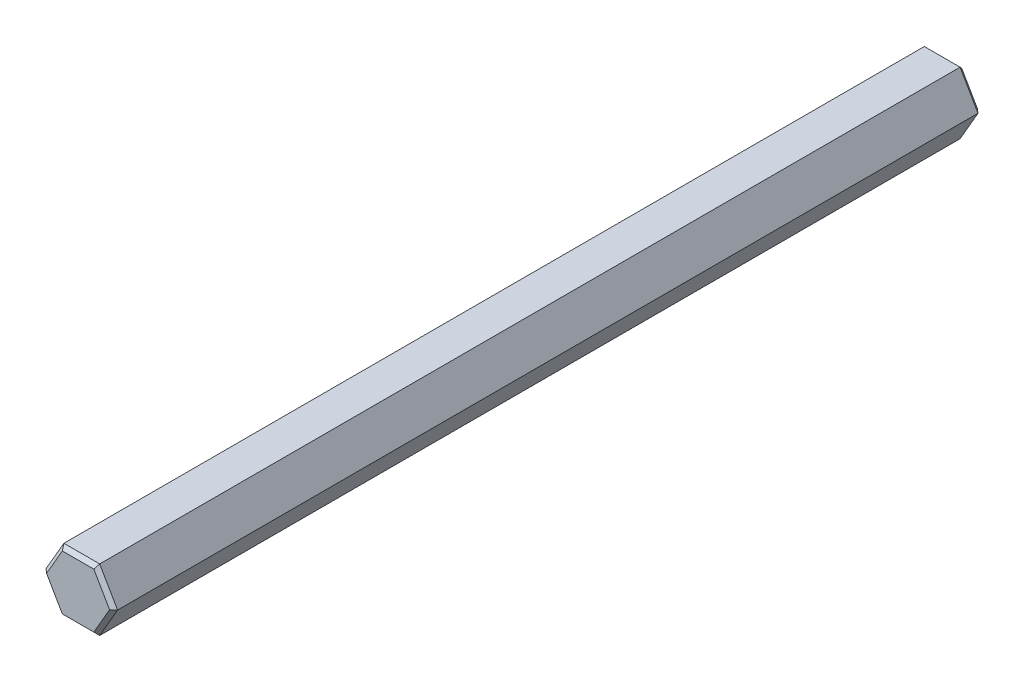
ISO-10303-21;
HEADER;
FILE_DESCRIPTION(('STEP AP214'),'2;1');
FILE_NAME('part.step','',(''),(''),'','','');
FILE_SCHEMA(('AUTOMOTIVE_DESIGN { 1 0 10303 214 1 1 1 1 }'));
ENDSEC;
DATA;
#1=APPLICATION_CONTEXT('core data for automotive mechanical design processes');
#2=APPLICATION_PROTOCOL_DEFINITION('international standard','automotive_design',2000,#1);
#3=PRODUCT_CONTEXT('',#1,'mechanical');
#4=PRODUCT('Part','Part','',(#3));
#5=PRODUCT_RELATED_PRODUCT_CATEGORY('part','',(#4));
#6=PRODUCT_DEFINITION_FORMATION('','',#4);
#7=PRODUCT_DEFINITION_CONTEXT('part definition',#1,'design');
#8=PRODUCT_DEFINITION('design','',#6,#7);
#9=PRODUCT_DEFINITION_SHAPE('','',#8);
#10=(LENGTH_UNIT() NAMED_UNIT(*) SI_UNIT(.MILLI.,.METRE.));
#11=(NAMED_UNIT(*) PLANE_ANGLE_UNIT() SI_UNIT($,.RADIAN.));
#12=(NAMED_UNIT(*) SI_UNIT($,.STERADIAN.) SOLID_ANGLE_UNIT());
#13=UNCERTAINTY_MEASURE_WITH_UNIT(LENGTH_MEASURE(1.E-05),#10,'distance_accuracy_value','');
#14=(GEOMETRIC_REPRESENTATION_CONTEXT(3) GLOBAL_UNCERTAINTY_ASSIGNED_CONTEXT((#13)) GLOBAL_UNIT_ASSIGNED_CONTEXT((#10,
#11,#12)) REPRESENTATION_CONTEXT('',''));
#15=CARTESIAN_POINT('',(0.,0.,0.));
#16=DIRECTION('',(0.,0.,1.));
#17=DIRECTION('',(1.,0.,0.));
#18=AXIS2_PLACEMENT_3D('',#15,#16,#17);
#19=CARTESIAN_POINT('',(-3.66617420935414,-6.35,177.8));
#20=DIRECTION('',(-0.866025403784439,-0.5,0.));
#21=DIRECTION('',(0.5,-0.866025403784439,0.));
#22=AXIS2_PLACEMENT_3D('',#19,#20,#21);
#23=PLANE('',#22);
#24=DIRECTION('',(0.,0.,-1.));
#25=VECTOR('',#24,1.);
#26=CARTESIAN_POINT('',(-3.66617420935414,-6.35,177.8));
#27=LINE('',#26,#25);
#28=CARTESIAN_POINT('',(-3.66617420935414,-6.35,177.038));
#29=VERTEX_POINT('',#28);
#30=CARTESIAN_POINT('',(-3.66617420935414,-6.35,0.762000000000013));
#31=VERTEX_POINT('',#30);
#32=EDGE_CURVE('E149',#29,#31,#27,.T.);
#33=ORIENTED_EDGE('',*,*,#32,.F.);
#34=DIRECTION('',(-0.5,0.866025403784439,0.));
#35=VECTOR('',#34,1.);
#36=CARTESIAN_POINT('',(-7.33234841870826,0.,177.038));
#37=LINE('',#36,#35);
#38=CARTESIAN_POINT('',(-7.33234841870826,0.,177.038));
#39=VERTEX_POINT('',#38);
#40=EDGE_CURVE('E181',#29,#39,#37,.T.);
#41=ORIENTED_EDGE('',*,*,#40,.T.);
#42=DIRECTION('',(0.,0.,-1.));
#43=VECTOR('',#42,1.);
#44=CARTESIAN_POINT('',(-7.33234841870826,0.,177.8));
#45=LINE('',#44,#43);
#46=CARTESIAN_POINT('',(-7.33234841870826,0.,0.762000000000013));
#47=VERTEX_POINT('',#46);
#48=EDGE_CURVE('E215',#39,#47,#45,.T.);
#49=ORIENTED_EDGE('',*,*,#48,.T.);
#50=DIRECTION('',(0.5,-0.866025403784439,0.));
#51=VECTOR('',#50,1.);
#52=CARTESIAN_POINT('',(-3.66617420935414,-6.35,0.762000000000013));
#53=LINE('',#52,#51);
#54=EDGE_CURVE('E137',#47,#31,#53,.T.);
#55=ORIENTED_EDGE('',*,*,#54,.T.);
#56=EDGE_LOOP('',(#33,#41,#49,#55));
#57=FACE_BOUND('',#56,.T.);
#58=ADVANCED_FACE('F33',(#57),#23,.T.);
#59=CARTESIAN_POINT('',(3.66617420935412,-6.35,177.8));
#60=DIRECTION('',(0.,-1.,0.));
#61=DIRECTION('',(0.,0.,-1.));
#62=AXIS2_PLACEMENT_3D('',#59,#60,#61);
#63=PLANE('',#62);
#64=DIRECTION('',(0.,0.,-1.));
#65=VECTOR('',#64,1.);
#66=CARTESIAN_POINT('',(3.66617420935412,-6.35,177.8));
#67=LINE('',#66,#65);
#68=CARTESIAN_POINT('',(3.66617420935412,-6.35,177.038));
#69=VERTEX_POINT('',#68);
#70=CARTESIAN_POINT('',(3.66617420935412,-6.35,0.762000000000013));
#71=VERTEX_POINT('',#70);
#72=EDGE_CURVE('E130',#69,#71,#67,.T.);
#73=ORIENTED_EDGE('',*,*,#72,.F.);
#74=DIRECTION('',(-1.,0.,0.));
#75=VECTOR('',#74,1.);
#76=CARTESIAN_POINT('',(-3.66617420935414,-6.35,177.038));
#77=LINE('',#76,#75);
#78=EDGE_CURVE('E145',#69,#29,#77,.T.);
#79=ORIENTED_EDGE('',*,*,#78,.T.);
#80=ORIENTED_EDGE('',*,*,#32,.T.);
#81=DIRECTION('',(1.,0.,0.));
#82=VECTOR('',#81,1.);
#83=CARTESIAN_POINT('',(3.66617420935412,-6.35,0.762000000000013));
#84=LINE('',#83,#82);
#85=EDGE_CURVE('E148',#31,#71,#84,.T.);
#86=ORIENTED_EDGE('',*,*,#85,.T.);
#87=EDGE_LOOP('',(#73,#79,#80,#86));
#88=FACE_BOUND('',#87,.T.);
#89=ADVANCED_FACE('F142',(#88),#63,.T.);
#90=CARTESIAN_POINT('',(7.33234841870826,0.,177.8));
#91=DIRECTION('',(0.866025403784438,-0.500000000000001,0.));
#92=DIRECTION('',(0.500000000000001,0.866025403784438,0.));
#93=AXIS2_PLACEMENT_3D('',#90,#91,#92);
#94=PLANE('',#93);
#95=DIRECTION('',(0.,0.,-1.));
#96=VECTOR('',#95,1.);
#97=CARTESIAN_POINT('',(7.33234841870826,0.,177.8));
#98=LINE('',#97,#96);
#99=CARTESIAN_POINT('',(7.33234841870826,0.,177.038));
#100=VERTEX_POINT('',#99);
#101=CARTESIAN_POINT('',(7.33234841870826,0.,0.762000000000013));
#102=VERTEX_POINT('',#101);
#103=EDGE_CURVE('E132',#100,#102,#98,.T.);
#104=ORIENTED_EDGE('',*,*,#103,.F.);
#105=DIRECTION('',(-0.500000000000001,-0.866025403784438,0.));
#106=VECTOR('',#105,1.);
#107=CARTESIAN_POINT('',(3.66617420935412,-6.35,177.038));
#108=LINE('',#107,#106);
#109=EDGE_CURVE('E126',#100,#69,#108,.T.);
#110=ORIENTED_EDGE('',*,*,#109,.T.);
#111=ORIENTED_EDGE('',*,*,#72,.T.);
#112=DIRECTION('',(0.500000000000001,0.866025403784438,0.));
#113=VECTOR('',#112,1.);
#114=CARTESIAN_POINT('',(7.33234841870826,0.,0.762000000000013));
#115=LINE('',#114,#113);
#116=EDGE_CURVE('E138',#71,#102,#115,.T.);
#117=ORIENTED_EDGE('',*,*,#116,.T.);
#118=EDGE_LOOP('',(#104,#110,#111,#117));
#119=FACE_BOUND('',#118,.T.);
#120=ADVANCED_FACE('F128',(#119),#94,.T.);
#121=CARTESIAN_POINT('',(3.66617420935414,6.35,177.8));
#122=DIRECTION('',(0.866025403784439,0.5,0.));
#123=DIRECTION('',(-0.5,0.866025403784439,0.));
#124=AXIS2_PLACEMENT_3D('',#121,#122,#123);
#125=PLANE('',#124);
#126=DIRECTION('',(0.,0.,-1.));
#127=VECTOR('',#126,1.);
#128=CARTESIAN_POINT('',(3.66617420935414,6.35,177.8));
#129=LINE('',#128,#127);
#130=CARTESIAN_POINT('',(3.66617420935414,6.35,177.038));
#131=VERTEX_POINT('',#130);
#132=CARTESIAN_POINT('',(3.66617420935414,6.35,0.762000000000013));
#133=VERTEX_POINT('',#132);
#134=EDGE_CURVE('E249',#131,#133,#129,.T.);
#135=ORIENTED_EDGE('',*,*,#134,.F.);
#136=DIRECTION('',(0.5,-0.866025403784439,0.));
#137=VECTOR('',#136,1.);
#138=CARTESIAN_POINT('',(7.33234841870826,0.,177.038));
#139=LINE('',#138,#137);
#140=EDGE_CURVE('E185',#131,#100,#139,.T.);
#141=ORIENTED_EDGE('',*,*,#140,.T.);
#142=ORIENTED_EDGE('',*,*,#103,.T.);
#143=DIRECTION('',(-0.5,0.866025403784439,0.));
#144=VECTOR('',#143,1.);
#145=CARTESIAN_POINT('',(3.66617420935414,6.35,0.762000000000013));
#146=LINE('',#145,#144);
#147=EDGE_CURVE('E183',#102,#133,#146,.T.);
#148=ORIENTED_EDGE('',*,*,#147,.T.);
#149=EDGE_LOOP('',(#135,#141,#142,#148));
#150=FACE_BOUND('',#149,.T.);
#151=ADVANCED_FACE('F266',(#150),#125,.T.);
#152=CARTESIAN_POINT('',(-3.66617420935412,6.35,177.8));
#153=DIRECTION('',(0.,1.,0.));
#154=DIRECTION('',(0.,0.,1.));
#155=AXIS2_PLACEMENT_3D('',#152,#153,#154);
#156=PLANE('',#155);
#157=DIRECTION('',(0.,0.,-1.));
#158=VECTOR('',#157,1.);
#159=CARTESIAN_POINT('',(-3.66617420935412,6.35,177.8));
#160=LINE('',#159,#158);
#161=CARTESIAN_POINT('',(-3.66617420935412,6.35,177.038));
#162=VERTEX_POINT('',#161);
#163=CARTESIAN_POINT('',(-3.66617420935412,6.35,0.762000000000013));
#164=VERTEX_POINT('',#163);
#165=EDGE_CURVE('E247',#162,#164,#160,.T.);
#166=ORIENTED_EDGE('',*,*,#165,.F.);
#167=DIRECTION('',(1.,0.,0.));
#168=VECTOR('',#167,1.);
#169=CARTESIAN_POINT('',(3.66617420935414,6.35,177.038));
#170=LINE('',#169,#168);
#171=EDGE_CURVE('E193',#162,#131,#170,.T.);
#172=ORIENTED_EDGE('',*,*,#171,.T.);
#173=ORIENTED_EDGE('',*,*,#134,.T.);
#174=DIRECTION('',(-1.,0.,0.));
#175=VECTOR('',#174,1.);
#176=CARTESIAN_POINT('',(-3.66617420935412,6.35,0.762000000000013));
#177=LINE('',#176,#175);
#178=EDGE_CURVE('E191',#133,#164,#177,.T.);
#179=ORIENTED_EDGE('',*,*,#178,.T.);
#180=EDGE_LOOP('',(#166,#172,#173,#179));
#181=FACE_BOUND('',#180,.T.);
#182=ADVANCED_FACE('F303',(#181),#156,.T.);
#183=CARTESIAN_POINT('',(-7.33234841870826,0.,177.8));
#184=DIRECTION('',(-0.866025403784438,0.5,0.));
#185=DIRECTION('',(-0.5,-0.866025403784439,0.));
#186=AXIS2_PLACEMENT_3D('',#183,#184,#185);
#187=PLANE('',#186);
#188=ORIENTED_EDGE('',*,*,#48,.F.);
#189=DIRECTION('',(0.5,0.866025403784439,0.));
#190=VECTOR('',#189,1.);
#191=CARTESIAN_POINT('',(-3.66617420935412,6.35,177.038));
#192=LINE('',#191,#190);
#193=EDGE_CURVE('E189',#39,#162,#192,.T.);
#194=ORIENTED_EDGE('',*,*,#193,.T.);
#195=ORIENTED_EDGE('',*,*,#165,.T.);
#196=DIRECTION('',(-0.5,-0.866025403784439,0.));
#197=VECTOR('',#196,1.);
#198=CARTESIAN_POINT('',(-7.33234841870826,0.,0.762000000000013));
#199=LINE('',#198,#197);
#200=EDGE_CURVE('E187',#164,#47,#199,.T.);
#201=ORIENTED_EDGE('',*,*,#200,.T.);
#202=EDGE_LOOP('',(#188,#194,#195,#201));
#203=FACE_BOUND('',#202,.T.);
#204=ADVANCED_FACE('F244',(#203),#187,.T.);
#205=CARTESIAN_POINT('',(0.,0.,177.8));
#206=DIRECTION('',(0.,0.,-1.));
#207=DIRECTION('',(-1.,0.,0.));
#208=AXIS2_PLACEMENT_3D('',#205,#206,#207);
#209=PLANE('',#208);
#210=DIRECTION('',(0.5,-0.866025403784439,0.));
#211=VECTOR('',#210,1.);
#212=CARTESIAN_POINT('',(-3.00626285167039,-5.96899999999999,177.8));
#213=LINE('',#212,#211);
#214=CARTESIAN_POINT('',(-6.45246660846325,0.,177.8));
#215=VERTEX_POINT('',#214);
#216=CARTESIAN_POINT('',(-3.22623330423164,-5.58799999999999,177.8));
#217=VERTEX_POINT('',#216);
#218=EDGE_CURVE('E174',#215,#217,#213,.T.);
#219=ORIENTED_EDGE('',*,*,#218,.T.);
#220=DIRECTION('',(1.,0.,0.));
#221=VECTOR('',#220,1.);
#222=CARTESIAN_POINT('',(3.66617420935412,-5.58799999999999,177.8));
#223=LINE('',#222,#221);
#224=CARTESIAN_POINT('',(3.22623330423162,-5.58799999999999,177.8));
#225=VERTEX_POINT('',#224);
#226=EDGE_CURVE('E177',#217,#225,#223,.T.);
#227=ORIENTED_EDGE('',*,*,#226,.T.);
#228=DIRECTION('',(0.500000000000001,0.866025403784438,0.));
#229=VECTOR('',#228,1.);
#230=CARTESIAN_POINT('',(6.6724370610245,0.381000000000013,177.8));
#231=LINE('',#230,#229);
#232=CARTESIAN_POINT('',(6.45246660846325,0.,177.8));
#233=VERTEX_POINT('',#232);
#234=EDGE_CURVE('E154',#225,#233,#231,.T.);
#235=ORIENTED_EDGE('',*,*,#234,.T.);
#236=DIRECTION('',(-0.5,0.866025403784439,0.));
#237=VECTOR('',#236,1.);
#238=CARTESIAN_POINT('',(3.00626285167038,5.96899999999999,177.8));
#239=LINE('',#238,#237);
#240=CARTESIAN_POINT('',(3.22623330423164,5.58799999999999,177.8));
#241=VERTEX_POINT('',#240);
#242=EDGE_CURVE('E172',#233,#241,#239,.T.);
#243=ORIENTED_EDGE('',*,*,#242,.T.);
#244=DIRECTION('',(-1.,0.,0.));
#245=VECTOR('',#244,1.);
#246=CARTESIAN_POINT('',(-3.66617420935412,5.58799999999999,177.8));
#247=LINE('',#246,#245);
#248=CARTESIAN_POINT('',(-3.22623330423162,5.58799999999999,177.8));
#249=VERTEX_POINT('',#248);
#250=EDGE_CURVE('E164',#241,#249,#247,.T.);
#251=ORIENTED_EDGE('',*,*,#250,.T.);
#252=DIRECTION('',(-0.5,-0.866025403784438,0.));
#253=VECTOR('',#252,1.);
#254=CARTESIAN_POINT('',(-6.6724370610245,-0.381000000000012,177.8));
#255=LINE('',#254,#253);
#256=EDGE_CURVE('E166',#249,#215,#255,.T.);
#257=ORIENTED_EDGE('',*,*,#256,.T.);
#258=EDGE_LOOP('',(#219,#227,#235,#243,#251,#257));
#259=FACE_BOUND('',#258,.T.);
#260=ADVANCED_FACE('F274',(#259),#209,.F.);
#261=CARTESIAN_POINT('',(0.,0.,0.));
#262=DIRECTION('',(0.,0.,-1.));
#263=DIRECTION('',(-1.,0.,0.));
#264=AXIS2_PLACEMENT_3D('',#261,#262,#263);
#265=PLANE('',#264);
#266=DIRECTION('',(0.5,-0.866025403784439,0.));
#267=VECTOR('',#266,1.);
#268=CARTESIAN_POINT('',(4.83934995634744,2.794,0.));
#269=LINE('',#268,#267);
#270=CARTESIAN_POINT('',(3.22623330423163,5.58799999999998,0.));
#271=VERTEX_POINT('',#270);
#272=CARTESIAN_POINT('',(6.45246660846325,0.,0.));
#273=VERTEX_POINT('',#272);
#274=EDGE_CURVE('E42',#271,#273,#269,.T.);
#275=ORIENTED_EDGE('',*,*,#274,.T.);
#276=DIRECTION('',(-0.500000000000001,-0.866025403784438,0.));
#277=VECTOR('',#276,1.);
#278=CARTESIAN_POINT('',(4.83934995634743,-2.794,0.));
#279=LINE('',#278,#277);
#280=CARTESIAN_POINT('',(3.22623330423162,-5.58799999999998,0.));
#281=VERTEX_POINT('',#280);
#282=EDGE_CURVE('E11',#273,#281,#279,.T.);
#283=ORIENTED_EDGE('',*,*,#282,.T.);
#284=DIRECTION('',(-1.,0.,0.));
#285=VECTOR('',#284,1.);
#286=CARTESIAN_POINT('',(0.,-5.58799999999998,0.));
#287=LINE('',#286,#285);
#288=CARTESIAN_POINT('',(-3.22623330423163,-5.58799999999998,0.));
#289=VERTEX_POINT('',#288);
#290=EDGE_CURVE('E201',#281,#289,#287,.T.);
#291=ORIENTED_EDGE('',*,*,#290,.T.);
#292=DIRECTION('',(-0.5,0.866025403784439,0.));
#293=VECTOR('',#292,1.);
#294=CARTESIAN_POINT('',(-4.83934995634744,-2.794,0.));
#295=LINE('',#294,#293);
#296=CARTESIAN_POINT('',(-6.45246660846325,0.,0.));
#297=VERTEX_POINT('',#296);
#298=EDGE_CURVE('E197',#289,#297,#295,.T.);
#299=ORIENTED_EDGE('',*,*,#298,.T.);
#300=DIRECTION('',(0.5,0.866025403784438,0.));
#301=VECTOR('',#300,1.);
#302=CARTESIAN_POINT('',(-4.83934995634743,2.794,0.));
#303=LINE('',#302,#301);
#304=CARTESIAN_POINT('',(-3.22623330423162,5.58799999999998,0.));
#305=VERTEX_POINT('',#304);
#306=EDGE_CURVE('E195',#297,#305,#303,.T.);
#307=ORIENTED_EDGE('',*,*,#306,.T.);
#308=DIRECTION('',(1.,0.,0.));
#309=VECTOR('',#308,1.);
#310=CARTESIAN_POINT('',(0.,5.58799999999998,0.));
#311=LINE('',#310,#309);
#312=EDGE_CURVE('E199',#305,#271,#311,.T.);
#313=ORIENTED_EDGE('',*,*,#312,.T.);
#314=EDGE_LOOP('',(#275,#283,#291,#299,#307,#313));
#315=FACE_BOUND('',#314,.T.);
#316=ADVANCED_FACE('F259',(#315),#265,.T.);
#317=CARTESIAN_POINT('',(-3.66617420935412,6.35,177.038));
#318=DIRECTION('',(0.,0.707106781186547,0.707106781186547));
#319=DIRECTION('',(-1.,0.,0.));
#320=AXIS2_PLACEMENT_3D('',#317,#318,#319);
#321=PLANE('',#320);
#322=DIRECTION('',(0.377964473009227,-0.654653670707977,0.654653670707977));
#323=VECTOR('',#322,1.);
#324=CARTESIAN_POINT('',(-3.66617420935412,6.35,177.038));
#325=LINE('',#324,#323);
#326=EDGE_CURVE('E209',#249,#162,#325,.F.);
#327=ORIENTED_EDGE('',*,*,#326,.F.);
#328=ORIENTED_EDGE('',*,*,#250,.F.);
#329=DIRECTION('',(0.377964473009227,0.654653670707977,-0.654653670707977));
#330=VECTOR('',#329,1.);
#331=CARTESIAN_POINT('',(2.61869586382439,4.53571428571428,178.852285714286));
#332=LINE('',#331,#330);
#333=EDGE_CURVE('E212',#131,#241,#332,.F.);
#334=ORIENTED_EDGE('',*,*,#333,.F.);
#335=ORIENTED_EDGE('',*,*,#171,.F.);
#336=EDGE_LOOP('',(#327,#328,#334,#335));
#337=FACE_BOUND('',#336,.T.);
#338=ADVANCED_FACE('F277',(#337),#321,.T.);
#339=CARTESIAN_POINT('',(3.66617420935414,6.35,177.038));
#340=DIRECTION('',(0.612372435695794,0.353553390593274,0.707106781186547));
#341=DIRECTION('',(-0.5,0.866025403784439,0.));
#342=AXIS2_PLACEMENT_3D('',#339,#340,#341);
#343=PLANE('',#342);
#344=ORIENTED_EDGE('',*,*,#333,.T.);
#345=ORIENTED_EDGE('',*,*,#242,.F.);
#346=DIRECTION('',(0.755928946018454,0.,-0.654653670707977));
#347=VECTOR('',#346,1.);
#348=CARTESIAN_POINT('',(5.23739172764876,0.,178.852285714286));
#349=LINE('',#348,#347);
#350=EDGE_CURVE('E207',#100,#233,#349,.F.);
#351=ORIENTED_EDGE('',*,*,#350,.F.);
#352=ORIENTED_EDGE('',*,*,#140,.F.);
#353=EDGE_LOOP('',(#344,#345,#351,#352));
#354=FACE_BOUND('',#353,.T.);
#355=ADVANCED_FACE('F270',(#354),#343,.T.);
#356=CARTESIAN_POINT('',(-7.33234841870826,0.,177.038));
#357=DIRECTION('',(-0.612372435695795,0.353553390593274,0.707106781186547));
#358=DIRECTION('',(-0.5,-0.866025403784439,0.));
#359=AXIS2_PLACEMENT_3D('',#356,#357,#358);
#360=PLANE('',#359);
#361=ORIENTED_EDGE('',*,*,#326,.T.);
#362=ORIENTED_EDGE('',*,*,#193,.F.);
#363=DIRECTION('',(0.755928946018454,0.,0.654653670707978));
#364=VECTOR('',#363,1.);
#365=CARTESIAN_POINT('',(-7.33234841870826,0.,177.038));
#366=LINE('',#365,#364);
#367=EDGE_CURVE('E158',#215,#39,#366,.F.);
#368=ORIENTED_EDGE('',*,*,#367,.F.);
#369=ORIENTED_EDGE('',*,*,#256,.F.);
#370=EDGE_LOOP('',(#361,#362,#368,#369));
#371=FACE_BOUND('',#370,.T.);
#372=ADVANCED_FACE('F282',(#371),#360,.T.);
#373=CARTESIAN_POINT('',(7.33234841870826,0.,177.038));
#374=DIRECTION('',(0.612372435695794,-0.353553390593275,0.707106781186547));
#375=DIRECTION('',(0.500000000000001,0.866025403784438,0.));
#376=AXIS2_PLACEMENT_3D('',#373,#374,#375);
#377=PLANE('',#376);
#378=ORIENTED_EDGE('',*,*,#350,.T.);
#379=ORIENTED_EDGE('',*,*,#234,.F.);
#380=DIRECTION('',(0.377964473009226,-0.654653670707977,-0.654653670707977));
#381=VECTOR('',#380,1.);
#382=CARTESIAN_POINT('',(2.61869586382437,-4.53571428571428,178.852285714286));
#383=LINE('',#382,#381);
#384=EDGE_CURVE('E152',#69,#225,#383,.F.);
#385=ORIENTED_EDGE('',*,*,#384,.F.);
#386=ORIENTED_EDGE('',*,*,#109,.F.);
#387=EDGE_LOOP('',(#378,#379,#385,#386));
#388=FACE_BOUND('',#387,.T.);
#389=ADVANCED_FACE('F153',(#388),#377,.T.);
#390=CARTESIAN_POINT('',(-3.66617420935414,-6.35,177.038));
#391=DIRECTION('',(-0.612372435695795,-0.353553390593274,0.707106781186547));
#392=DIRECTION('',(0.5,-0.866025403784439,0.));
#393=AXIS2_PLACEMENT_3D('',#390,#391,#392);
#394=PLANE('',#393);
#395=ORIENTED_EDGE('',*,*,#367,.T.);
#396=ORIENTED_EDGE('',*,*,#40,.F.);
#397=DIRECTION('',(0.377964473009226,0.654653670707977,0.654653670707977));
#398=VECTOR('',#397,1.);
#399=CARTESIAN_POINT('',(-3.66617420935414,-6.35,177.038));
#400=LINE('',#399,#398);
#401=EDGE_CURVE('E159',#217,#29,#400,.F.);
#402=ORIENTED_EDGE('',*,*,#401,.F.);
#403=ORIENTED_EDGE('',*,*,#218,.F.);
#404=EDGE_LOOP('',(#395,#396,#402,#403));
#405=FACE_BOUND('',#404,.T.);
#406=ADVANCED_FACE('F285',(#405),#394,.T.);
#407=CARTESIAN_POINT('',(3.66617420935412,-6.35,177.038));
#408=DIRECTION('',(0.,-0.707106781186547,0.707106781186547));
#409=DIRECTION('',(1.,0.,0.));
#410=AXIS2_PLACEMENT_3D('',#407,#408,#409);
#411=PLANE('',#410);
#412=ORIENTED_EDGE('',*,*,#384,.T.);
#413=ORIENTED_EDGE('',*,*,#226,.F.);
#414=ORIENTED_EDGE('',*,*,#401,.T.);
#415=ORIENTED_EDGE('',*,*,#78,.F.);
#416=EDGE_LOOP('',(#412,#413,#414,#415));
#417=FACE_BOUND('',#416,.T.);
#418=ADVANCED_FACE('F161',(#417),#411,.T.);
#419=CARTESIAN_POINT('',(-4.83934995634743,2.794,0.));
#420=DIRECTION('',(0.612372435695793,-0.353553390593273,0.707106781186549));
#421=DIRECTION('',(0.5,0.866025403784439,0.));
#422=AXIS2_PLACEMENT_3D('',#419,#420,#421);
#423=PLANE('',#422);
#424=DIRECTION('',(-0.755928946018456,0.,0.654653670707976));
#425=VECTOR('',#424,1.);
#426=CARTESIAN_POINT('',(-5.53068566439706,0.,-0.798285714285715));
#427=LINE('',#426,#425);
#428=EDGE_CURVE('E224',#47,#297,#427,.F.);
#429=ORIENTED_EDGE('',*,*,#428,.F.);
#430=ORIENTED_EDGE('',*,*,#200,.F.);
#431=DIRECTION('',(0.377964473009227,-0.654653670707979,-0.654653670707976));
#432=VECTOR('',#431,1.);
#433=CARTESIAN_POINT('',(-2.76534283219853,4.78971428571427,-0.798285714285712));
#434=LINE('',#433,#432);
#435=EDGE_CURVE('E37',#305,#164,#434,.F.);
#436=ORIENTED_EDGE('',*,*,#435,.F.);
#437=ORIENTED_EDGE('',*,*,#306,.F.);
#438=EDGE_LOOP('',(#429,#430,#436,#437));
#439=FACE_BOUND('',#438,.T.);
#440=ADVANCED_FACE('F35',(#439),#423,.F.);
#441=CARTESIAN_POINT('',(0.,5.58799999999998,0.));
#442=DIRECTION('',(0.,-0.707106781186546,0.707106781186549));
#443=DIRECTION('',(1.,0.,0.));
#444=AXIS2_PLACEMENT_3D('',#441,#442,#443);
#445=PLANE('',#444);
#446=ORIENTED_EDGE('',*,*,#435,.T.);
#447=ORIENTED_EDGE('',*,*,#178,.F.);
#448=DIRECTION('',(-0.377964473009228,-0.654653670707978,-0.654653670707975));
#449=VECTOR('',#448,1.);
#450=CARTESIAN_POINT('',(2.76534283219854,4.78971428571427,-0.798285714285716));
#451=LINE('',#450,#449);
#452=EDGE_CURVE('E222',#271,#133,#451,.F.);
#453=ORIENTED_EDGE('',*,*,#452,.F.);
#454=ORIENTED_EDGE('',*,*,#312,.F.);
#455=EDGE_LOOP('',(#446,#447,#453,#454));
#456=FACE_BOUND('',#455,.T.);
#457=ADVANCED_FACE('F235',(#456),#445,.F.);
#458=CARTESIAN_POINT('',(-4.83934995634744,-2.794,0.));
#459=DIRECTION('',(0.612372435695793,0.353553390593273,0.707106781186549));
#460=DIRECTION('',(-0.5,0.866025403784439,0.));
#461=AXIS2_PLACEMENT_3D('',#458,#459,#460);
#462=PLANE('',#461);
#463=ORIENTED_EDGE('',*,*,#428,.T.);
#464=ORIENTED_EDGE('',*,*,#298,.F.);
#465=DIRECTION('',(-0.377964473009228,-0.654653670707979,0.654653670707976));
#466=VECTOR('',#465,1.);
#467=CARTESIAN_POINT('',(-2.76534283219854,-4.78971428571427,-0.798285714285711));
#468=LINE('',#467,#466);
#469=EDGE_CURVE('E219',#31,#289,#468,.F.);
#470=ORIENTED_EDGE('',*,*,#469,.F.);
#471=ORIENTED_EDGE('',*,*,#54,.F.);
#472=EDGE_LOOP('',(#463,#464,#470,#471));
#473=FACE_BOUND('',#472,.T.);
#474=ADVANCED_FACE('F256',(#473),#462,.F.);
#475=CARTESIAN_POINT('',(4.83934995634744,2.794,0.));
#476=DIRECTION('',(-0.612372435695793,-0.353553390593273,0.707106781186549));
#477=DIRECTION('',(0.5,-0.866025403784439,0.));
#478=AXIS2_PLACEMENT_3D('',#475,#476,#477);
#479=PLANE('',#478);
#480=ORIENTED_EDGE('',*,*,#452,.T.);
#481=ORIENTED_EDGE('',*,*,#147,.F.);
#482=DIRECTION('',(-0.755928946018456,0.,-0.654653670707975));
#483=VECTOR('',#482,1.);
#484=CARTESIAN_POINT('',(5.53068566439707,0.,-0.798285714285711));
#485=LINE('',#484,#483);
#486=EDGE_CURVE('E217',#273,#102,#485,.F.);
#487=ORIENTED_EDGE('',*,*,#486,.F.);
#488=ORIENTED_EDGE('',*,*,#274,.F.);
#489=EDGE_LOOP('',(#480,#481,#487,#488));
#490=FACE_BOUND('',#489,.T.);
#491=ADVANCED_FACE('F263',(#490),#479,.F.);
#492=CARTESIAN_POINT('',(0.,-5.58799999999998,0.));
#493=DIRECTION('',(0.,0.707106781186546,0.707106781186549));
#494=DIRECTION('',(-1.,0.,0.));
#495=AXIS2_PLACEMENT_3D('',#492,#493,#494);
#496=PLANE('',#495);
#497=ORIENTED_EDGE('',*,*,#469,.T.);
#498=ORIENTED_EDGE('',*,*,#290,.F.);
#499=DIRECTION('',(0.377964473009227,-0.654653670707979,0.654653670707976));
#500=VECTOR('',#499,1.);
#501=CARTESIAN_POINT('',(2.76534283219853,-4.78971428571427,-0.798285714285708));
#502=LINE('',#501,#500);
#503=EDGE_CURVE('E56',#71,#281,#502,.F.);
#504=ORIENTED_EDGE('',*,*,#503,.F.);
#505=ORIENTED_EDGE('',*,*,#85,.F.);
#506=EDGE_LOOP('',(#497,#498,#504,#505));
#507=FACE_BOUND('',#506,.T.);
#508=ADVANCED_FACE('F258',(#507),#496,.F.);
#509=CARTESIAN_POINT('',(4.83934995634743,-2.794,0.));
#510=DIRECTION('',(-0.612372435695793,0.353553390593274,0.707106781186549));
#511=DIRECTION('',(-0.500000000000001,-0.866025403784438,0.));
#512=AXIS2_PLACEMENT_3D('',#509,#510,#511);
#513=PLANE('',#512);
#514=ORIENTED_EDGE('',*,*,#486,.T.);
#515=ORIENTED_EDGE('',*,*,#116,.F.);
#516=ORIENTED_EDGE('',*,*,#503,.T.);
#517=ORIENTED_EDGE('',*,*,#282,.F.);
#518=EDGE_LOOP('',(#514,#515,#516,#517));
#519=FACE_BOUND('',#518,.T.);
#520=ADVANCED_FACE('F260',(#519),#513,.F.);
#521=CLOSED_SHELL('',(#58,#89,#120,#151,#182,#204,#260,#316,#338,#355,#372,#389,#406,#418,#440,
#457,#474,#491,#508,#520));
#522=MANIFOLD_SOLID_BREP('B2',#521);
#523=ADVANCED_BREP_SHAPE_REPRESENTATION('',(#18,#522),#14);
#524=SHAPE_DEFINITION_REPRESENTATION(#9,#523);
ENDSEC;
END-ISO-10303-21;
